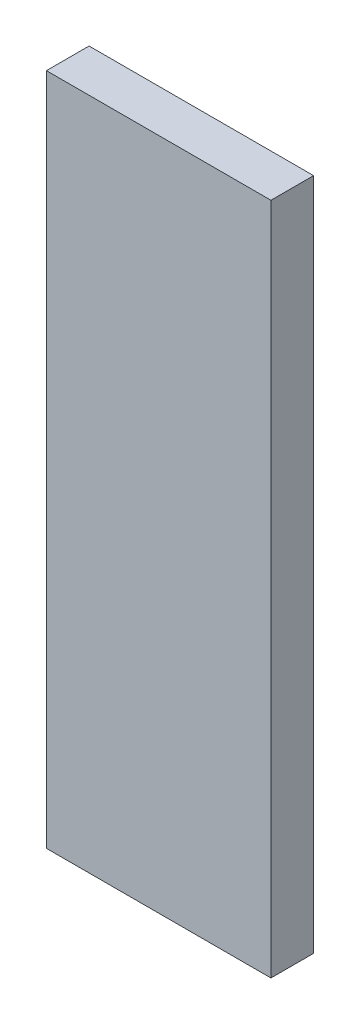
ISO-10303-21;
HEADER;
FILE_DESCRIPTION(('STEP AP214'),'2;1');
FILE_NAME('part.step','',(''),(''),'','','');
FILE_SCHEMA(('AUTOMOTIVE_DESIGN { 1 0 10303 214 1 1 1 1 }'));
ENDSEC;
DATA;
#1=APPLICATION_CONTEXT('core data for automotive mechanical design processes');
#2=APPLICATION_PROTOCOL_DEFINITION('international standard','automotive_design',2000,#1);
#3=PRODUCT_CONTEXT('',#1,'mechanical');
#4=PRODUCT('Part','Part','',(#3));
#5=PRODUCT_RELATED_PRODUCT_CATEGORY('part','',(#4));
#6=PRODUCT_DEFINITION_FORMATION('','',#4);
#7=PRODUCT_DEFINITION_CONTEXT('part definition',#1,'design');
#8=PRODUCT_DEFINITION('design','',#6,#7);
#9=PRODUCT_DEFINITION_SHAPE('','',#8);
#10=(LENGTH_UNIT() NAMED_UNIT(*) SI_UNIT(.MILLI.,.METRE.));
#11=(NAMED_UNIT(*) PLANE_ANGLE_UNIT() SI_UNIT($,.RADIAN.));
#12=(NAMED_UNIT(*) SI_UNIT($,.STERADIAN.) SOLID_ANGLE_UNIT());
#13=UNCERTAINTY_MEASURE_WITH_UNIT(LENGTH_MEASURE(1.E-05),#10,'distance_accuracy_value','');
#14=(GEOMETRIC_REPRESENTATION_CONTEXT(3) GLOBAL_UNCERTAINTY_ASSIGNED_CONTEXT((#13)) GLOBAL_UNIT_ASSIGNED_CONTEXT((#10,
#11,#12)) REPRESENTATION_CONTEXT('',''));
#15=CARTESIAN_POINT('',(0.,0.,0.));
#16=DIRECTION('',(0.,0.,1.));
#17=DIRECTION('',(1.,0.,0.));
#18=AXIS2_PLACEMENT_3D('',#15,#16,#17);
#19=CARTESIAN_POINT('',(0.,0.,19.));
#20=DIRECTION('',(1.,0.,0.));
#21=DIRECTION('',(0.,1.,0.));
#22=AXIS2_PLACEMENT_3D('',#19,#20,#21);
#23=PLANE('',#22);
#24=DIRECTION('',(0.,-1.,0.));
#25=VECTOR('',#24,1.);
#26=CARTESIAN_POINT('',(0.,0.,0.));
#27=LINE('',#26,#25);
#28=CARTESIAN_POINT('',(0.,300.,0.));
#29=VERTEX_POINT('',#28);
#30=CARTESIAN_POINT('',(0.,0.,0.));
#31=VERTEX_POINT('',#30);
#32=EDGE_CURVE('E109',#29,#31,#27,.T.);
#33=ORIENTED_EDGE('',*,*,#32,.T.);
#34=DIRECTION('',(0.,0.,-1.));
#35=VECTOR('',#34,1.);
#36=CARTESIAN_POINT('',(0.,0.,19.));
#37=LINE('',#36,#35);
#38=CARTESIAN_POINT('',(0.,0.,19.));
#39=VERTEX_POINT('',#38);
#40=EDGE_CURVE('E11',#39,#31,#37,.T.);
#41=ORIENTED_EDGE('',*,*,#40,.F.);
#42=DIRECTION('',(0.,-1.,0.));
#43=VECTOR('',#42,1.);
#44=CARTESIAN_POINT('',(0.,0.,19.));
#45=LINE('',#44,#43);
#46=CARTESIAN_POINT('',(0.,300.,19.));
#47=VERTEX_POINT('',#46);
#48=EDGE_CURVE('E93',#47,#39,#45,.T.);
#49=ORIENTED_EDGE('',*,*,#48,.F.);
#50=DIRECTION('',(0.,0.,-1.));
#51=VECTOR('',#50,1.);
#52=CARTESIAN_POINT('',(0.,300.,19.));
#53=LINE('',#52,#51);
#54=EDGE_CURVE('E105',#47,#29,#53,.T.);
#55=ORIENTED_EDGE('',*,*,#54,.T.);
#56=EDGE_LOOP('',(#33,#41,#49,#55));
#57=FACE_BOUND('',#56,.T.);
#58=ADVANCED_FACE('F41',(#57),#23,.F.);
#59=CARTESIAN_POINT('',(0.,0.,19.));
#60=DIRECTION('',(0.,1.,0.));
#61=DIRECTION('',(0.,0.,1.));
#62=AXIS2_PLACEMENT_3D('',#59,#60,#61);
#63=PLANE('',#62);
#64=DIRECTION('',(1.,0.,0.));
#65=VECTOR('',#64,1.);
#66=CARTESIAN_POINT('',(0.,0.,0.));
#67=LINE('',#66,#65);
#68=CARTESIAN_POINT('',(100.,0.,0.));
#69=VERTEX_POINT('',#68);
#70=EDGE_CURVE('E98',#31,#69,#67,.T.);
#71=ORIENTED_EDGE('',*,*,#70,.T.);
#72=DIRECTION('',(0.,0.,-1.));
#73=VECTOR('',#72,1.);
#74=CARTESIAN_POINT('',(100.,0.,19.));
#75=LINE('',#74,#73);
#76=CARTESIAN_POINT('',(100.,0.,19.));
#77=VERTEX_POINT('',#76);
#78=EDGE_CURVE('E50',#77,#69,#75,.T.);
#79=ORIENTED_EDGE('',*,*,#78,.F.);
#80=DIRECTION('',(1.,0.,0.));
#81=VECTOR('',#80,1.);
#82=CARTESIAN_POINT('',(0.,0.,19.));
#83=LINE('',#82,#81);
#84=EDGE_CURVE('E88',#39,#77,#83,.T.);
#85=ORIENTED_EDGE('',*,*,#84,.F.);
#86=ORIENTED_EDGE('',*,*,#40,.T.);
#87=EDGE_LOOP('',(#71,#79,#85,#86));
#88=FACE_BOUND('',#87,.T.);
#89=ADVANCED_FACE('F97',(#88),#63,.F.);
#90=CARTESIAN_POINT('',(100.,0.,19.));
#91=DIRECTION('',(-1.,0.,0.));
#92=DIRECTION('',(0.,-1.,0.));
#93=AXIS2_PLACEMENT_3D('',#90,#91,#92);
#94=PLANE('',#93);
#95=DIRECTION('',(0.,1.,0.));
#96=VECTOR('',#95,1.);
#97=CARTESIAN_POINT('',(100.,0.,0.));
#98=LINE('',#97,#96);
#99=CARTESIAN_POINT('',(99.9999999999999,300.,0.));
#100=VERTEX_POINT('',#99);
#101=EDGE_CURVE('E75',#69,#100,#98,.T.);
#102=ORIENTED_EDGE('',*,*,#101,.T.);
#103=DIRECTION('',(0.,0.,-1.));
#104=VECTOR('',#103,1.);
#105=CARTESIAN_POINT('',(99.9999999999999,300.,19.));
#106=LINE('',#105,#104);
#107=CARTESIAN_POINT('',(99.9999999999999,300.,19.));
#108=VERTEX_POINT('',#107);
#109=EDGE_CURVE('E100',#108,#100,#106,.T.);
#110=ORIENTED_EDGE('',*,*,#109,.F.);
#111=DIRECTION('',(0.,1.,0.));
#112=VECTOR('',#111,1.);
#113=CARTESIAN_POINT('',(100.,0.,19.));
#114=LINE('',#113,#112);
#115=EDGE_CURVE('E91',#77,#108,#114,.T.);
#116=ORIENTED_EDGE('',*,*,#115,.F.);
#117=ORIENTED_EDGE('',*,*,#78,.T.);
#118=EDGE_LOOP('',(#102,#110,#116,#117));
#119=FACE_BOUND('',#118,.T.);
#120=ADVANCED_FACE('F101',(#119),#94,.F.);
#121=CARTESIAN_POINT('',(0.,300.,19.));
#122=DIRECTION('',(0.,-1.,0.));
#123=DIRECTION('',(0.,0.,-1.));
#124=AXIS2_PLACEMENT_3D('',#121,#122,#123);
#125=PLANE('',#124);
#126=DIRECTION('',(-1.,0.,0.));
#127=VECTOR('',#126,1.);
#128=CARTESIAN_POINT('',(0.,300.,0.));
#129=LINE('',#128,#127);
#130=EDGE_CURVE('E81',#100,#29,#129,.T.);
#131=ORIENTED_EDGE('',*,*,#130,.T.);
#132=ORIENTED_EDGE('',*,*,#54,.F.);
#133=DIRECTION('',(-1.,0.,0.));
#134=VECTOR('',#133,1.);
#135=CARTESIAN_POINT('',(0.,300.,19.));
#136=LINE('',#135,#134);
#137=EDGE_CURVE('E58',#108,#47,#136,.T.);
#138=ORIENTED_EDGE('',*,*,#137,.F.);
#139=ORIENTED_EDGE('',*,*,#109,.T.);
#140=EDGE_LOOP('',(#131,#132,#138,#139));
#141=FACE_BOUND('',#140,.T.);
#142=ADVANCED_FACE('F122',(#141),#125,.F.);
#143=CARTESIAN_POINT('',(0.,0.,19.));
#144=DIRECTION('',(0.,0.,-1.));
#145=DIRECTION('',(-1.,0.,0.));
#146=AXIS2_PLACEMENT_3D('',#143,#144,#145);
#147=PLANE('',#146);
#148=ORIENTED_EDGE('',*,*,#48,.T.);
#149=ORIENTED_EDGE('',*,*,#84,.T.);
#150=ORIENTED_EDGE('',*,*,#115,.T.);
#151=ORIENTED_EDGE('',*,*,#137,.T.);
#152=EDGE_LOOP('',(#148,#149,#150,#151));
#153=FACE_BOUND('',#152,.T.);
#154=ADVANCED_FACE('F89',(#153),#147,.F.);
#155=CARTESIAN_POINT('',(0.,0.,0.));
#156=DIRECTION('',(0.,0.,-1.));
#157=DIRECTION('',(-1.,0.,0.));
#158=AXIS2_PLACEMENT_3D('',#155,#156,#157);
#159=PLANE('',#158);
#160=ORIENTED_EDGE('',*,*,#32,.F.);
#161=ORIENTED_EDGE('',*,*,#130,.F.);
#162=ORIENTED_EDGE('',*,*,#101,.F.);
#163=ORIENTED_EDGE('',*,*,#70,.F.);
#164=EDGE_LOOP('',(#160,#161,#162,#163));
#165=FACE_BOUND('',#164,.T.);
#166=ADVANCED_FACE('F125',(#165),#159,.T.);
#167=CLOSED_SHELL('',(#58,#89,#120,#142,#154,#166));
#168=MANIFOLD_SOLID_BREP('B2',#167);
#169=ADVANCED_BREP_SHAPE_REPRESENTATION('',(#18,#168),#14);
#170=SHAPE_DEFINITION_REPRESENTATION(#9,#169);
ENDSEC;
END-ISO-10303-21;
